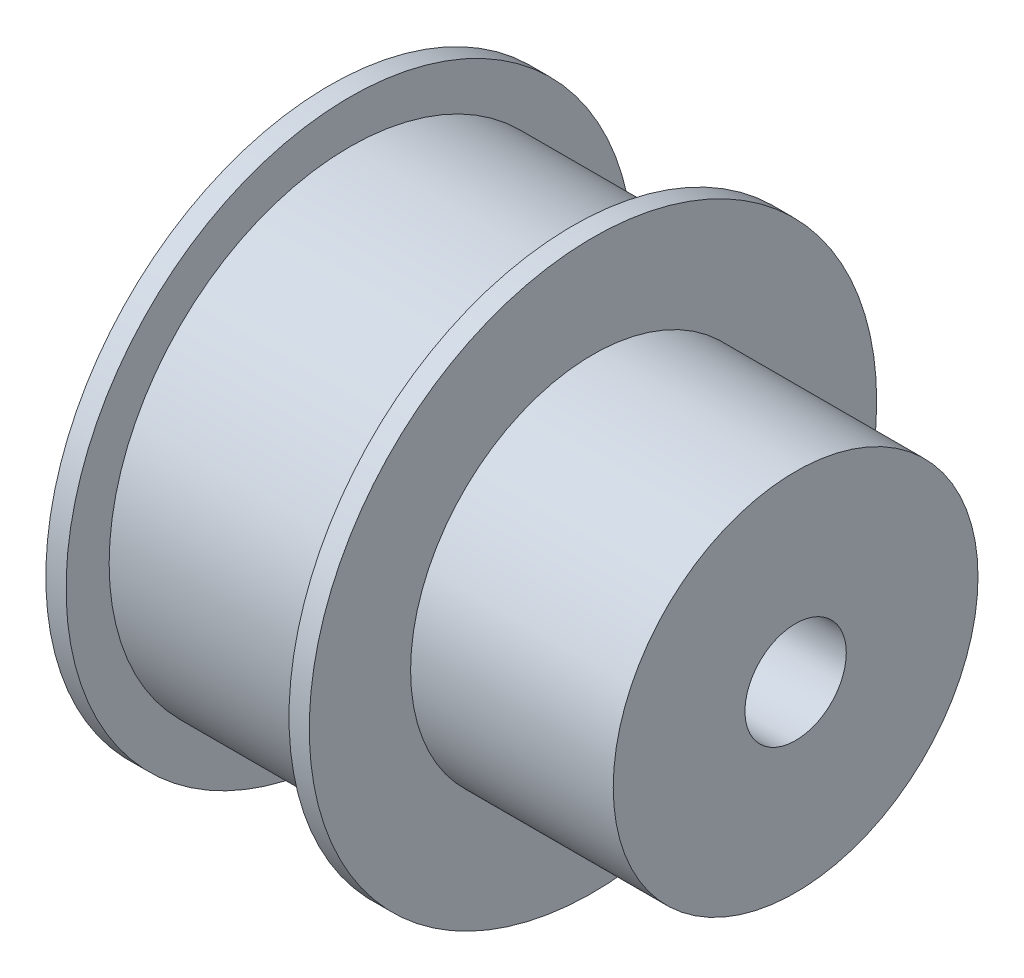
ISO-10303-21;
HEADER;
FILE_DESCRIPTION(('STEP AP214'),'2;1');
FILE_NAME('part.step','',(''),(''),'','','');
FILE_SCHEMA(('AUTOMOTIVE_DESIGN { 1 0 10303 214 1 1 1 1 }'));
ENDSEC;
DATA;
#1=APPLICATION_CONTEXT('core data for automotive mechanical design processes');
#2=APPLICATION_PROTOCOL_DEFINITION('international standard','automotive_design',2000,#1);
#3=PRODUCT_CONTEXT('',#1,'mechanical');
#4=PRODUCT('Part','Part','',(#3));
#5=PRODUCT_RELATED_PRODUCT_CATEGORY('part','',(#4));
#6=PRODUCT_DEFINITION_FORMATION('','',#4);
#7=PRODUCT_DEFINITION_CONTEXT('part definition',#1,'design');
#8=PRODUCT_DEFINITION('design','',#6,#7);
#9=PRODUCT_DEFINITION_SHAPE('','',#8);
#10=(LENGTH_UNIT() NAMED_UNIT(*) SI_UNIT(.MILLI.,.METRE.));
#11=(NAMED_UNIT(*) PLANE_ANGLE_UNIT() SI_UNIT($,.RADIAN.));
#12=(NAMED_UNIT(*) SI_UNIT($,.STERADIAN.) SOLID_ANGLE_UNIT());
#13=UNCERTAINTY_MEASURE_WITH_UNIT(LENGTH_MEASURE(1.E-05),#10,'distance_accuracy_value','');
#14=(GEOMETRIC_REPRESENTATION_CONTEXT(3) GLOBAL_UNCERTAINTY_ASSIGNED_CONTEXT((#13)) GLOBAL_UNIT_ASSIGNED_CONTEXT((#10,
#11,#12)) REPRESENTATION_CONTEXT('',''));
#15=CARTESIAN_POINT('',(0.,0.,0.));
#16=DIRECTION('',(0.,0.,1.));
#17=DIRECTION('',(1.,0.,0.));
#18=AXIS2_PLACEMENT_3D('',#15,#16,#17);
#19=CARTESIAN_POINT('',(1.,0.,0.));
#20=DIRECTION('',(-1.,0.,0.));
#21=DIRECTION('',(0.,0.,1.));
#22=AXIS2_PLACEMENT_3D('',#19,#20,#21);
#23=CYLINDRICAL_SURFACE('',#22,14.);
#24=CARTESIAN_POINT('',(1.,0.,0.));
#25=DIRECTION('',(1.,0.,0.));
#26=DIRECTION('',(0.,0.,-1.));
#27=AXIS2_PLACEMENT_3D('',#24,#25,#26);
#28=CIRCLE('',#27,14.);
#29=CARTESIAN_POINT('',(1.,0.,-14.));
#30=VERTEX_POINT('',#29);
#31=EDGE_CURVE('E10',#30,#30,#28,.T.);
#32=ORIENTED_EDGE('',*,*,#31,.F.);
#33=EDGE_LOOP('',(#32));
#34=FACE_BOUND('',#33,.T.);
#35=CARTESIAN_POINT('',(0.,0.,0.));
#36=DIRECTION('',(1.,0.,0.));
#37=DIRECTION('',(0.,0.,-1.));
#38=AXIS2_PLACEMENT_3D('',#35,#36,#37);
#39=CIRCLE('',#38,14.);
#40=CARTESIAN_POINT('',(0.,0.,-14.));
#41=VERTEX_POINT('',#40);
#42=EDGE_CURVE('E33',#41,#41,#39,.T.);
#43=ORIENTED_EDGE('',*,*,#42,.T.);
#44=EDGE_LOOP('',(#43));
#45=FACE_BOUND('',#44,.T.);
#46=ADVANCED_FACE('F30',(#34,#45),#23,.T.);
#47=CARTESIAN_POINT('',(1.,0.,0.));
#48=DIRECTION('',(1.,0.,0.));
#49=DIRECTION('',(0.,0.,-1.));
#50=AXIS2_PLACEMENT_3D('',#47,#48,#49);
#51=PLANE('',#50);
#52=CARTESIAN_POINT('',(1.,0.,0.));
#53=DIRECTION('',(1.,0.,0.));
#54=DIRECTION('',(0.,0.,-1.));
#55=AXIS2_PLACEMENT_3D('',#52,#53,#54);
#56=CIRCLE('',#55,11.875);
#57=CARTESIAN_POINT('',(1.,0.,-11.875));
#58=VERTEX_POINT('',#57);
#59=EDGE_CURVE('E42',#58,#58,#56,.T.);
#60=ORIENTED_EDGE('',*,*,#59,.F.);
#61=EDGE_LOOP('',(#60));
#62=FACE_BOUND('',#61,.T.);
#63=ORIENTED_EDGE('',*,*,#31,.T.);
#64=EDGE_LOOP('',(#63));
#65=FACE_BOUND('',#64,.T.);
#66=ADVANCED_FACE('F107',(#62,#65),#51,.T.);
#67=CARTESIAN_POINT('',(0.,0.,0.));
#68=DIRECTION('',(1.,0.,0.));
#69=DIRECTION('',(0.,0.,-1.));
#70=AXIS2_PLACEMENT_3D('',#67,#68,#69);
#71=PLANE('',#70);
#72=CARTESIAN_POINT('',(0.,0.,0.));
#73=DIRECTION('',(1.,0.,0.));
#74=DIRECTION('',(0.,0.,-1.));
#75=AXIS2_PLACEMENT_3D('',#72,#73,#74);
#76=CIRCLE('',#75,2.5);
#77=CARTESIAN_POINT('',(0.,0.,-2.5));
#78=VERTEX_POINT('',#77);
#79=EDGE_CURVE('E57',#78,#78,#76,.T.);
#80=ORIENTED_EDGE('',*,*,#79,.T.);
#81=EDGE_LOOP('',(#80));
#82=FACE_BOUND('',#81,.T.);
#83=ORIENTED_EDGE('',*,*,#42,.F.);
#84=EDGE_LOOP('',(#83));
#85=FACE_BOUND('',#84,.T.);
#86=ADVANCED_FACE('F66',(#82,#85),#71,.F.);
#87=CARTESIAN_POINT('',(12.,0.,0.));
#88=DIRECTION('',(-1.,0.,0.));
#89=DIRECTION('',(0.,0.,1.));
#90=AXIS2_PLACEMENT_3D('',#87,#88,#89);
#91=CYLINDRICAL_SURFACE('',#90,11.875);
#92=CARTESIAN_POINT('',(12.,0.,0.));
#93=DIRECTION('',(1.,0.,0.));
#94=DIRECTION('',(0.,0.,-1.));
#95=AXIS2_PLACEMENT_3D('',#92,#93,#94);
#96=CIRCLE('',#95,11.875);
#97=CARTESIAN_POINT('',(12.,0.,-11.875));
#98=VERTEX_POINT('',#97);
#99=EDGE_CURVE('E40',#98,#98,#96,.T.);
#100=ORIENTED_EDGE('',*,*,#99,.F.);
#101=EDGE_LOOP('',(#100));
#102=FACE_BOUND('',#101,.T.);
#103=ORIENTED_EDGE('',*,*,#59,.T.);
#104=EDGE_LOOP('',(#103));
#105=FACE_BOUND('',#104,.T.);
#106=ADVANCED_FACE('F97',(#102,#105),#91,.T.);
#107=CARTESIAN_POINT('',(13.,0.,0.));
#108=DIRECTION('',(-1.,0.,0.));
#109=DIRECTION('',(0.,0.,1.));
#110=AXIS2_PLACEMENT_3D('',#107,#108,#109);
#111=CYLINDRICAL_SURFACE('',#110,14.);
#112=CARTESIAN_POINT('',(13.,0.,0.));
#113=DIRECTION('',(1.,0.,0.));
#114=DIRECTION('',(0.,0.,-1.));
#115=AXIS2_PLACEMENT_3D('',#112,#113,#114);
#116=CIRCLE('',#115,14.);
#117=CARTESIAN_POINT('',(13.,0.,-14.));
#118=VERTEX_POINT('',#117);
#119=EDGE_CURVE('E45',#118,#118,#116,.T.);
#120=ORIENTED_EDGE('',*,*,#119,.F.);
#121=EDGE_LOOP('',(#120));
#122=FACE_BOUND('',#121,.T.);
#123=CARTESIAN_POINT('',(12.,0.,0.));
#124=DIRECTION('',(1.,0.,0.));
#125=DIRECTION('',(0.,0.,-1.));
#126=AXIS2_PLACEMENT_3D('',#123,#124,#125);
#127=CIRCLE('',#126,14.);
#128=CARTESIAN_POINT('',(12.,0.,-14.));
#129=VERTEX_POINT('',#128);
#130=EDGE_CURVE('E48',#129,#129,#127,.T.);
#131=ORIENTED_EDGE('',*,*,#130,.T.);
#132=EDGE_LOOP('',(#131));
#133=FACE_BOUND('',#132,.T.);
#134=ADVANCED_FACE('F91',(#122,#133),#111,.T.);
#135=CARTESIAN_POINT('',(13.,0.,0.));
#136=DIRECTION('',(1.,0.,0.));
#137=DIRECTION('',(0.,0.,-1.));
#138=AXIS2_PLACEMENT_3D('',#135,#136,#137);
#139=PLANE('',#138);
#140=CARTESIAN_POINT('',(13.,0.,0.));
#141=DIRECTION('',(1.,0.,0.));
#142=DIRECTION('',(0.,0.,-1.));
#143=AXIS2_PLACEMENT_3D('',#140,#141,#142);
#144=CIRCLE('',#143,9.);
#145=CARTESIAN_POINT('',(13.,0.,-9.));
#146=VERTEX_POINT('',#145);
#147=EDGE_CURVE('E54',#146,#146,#144,.T.);
#148=ORIENTED_EDGE('',*,*,#147,.F.);
#149=EDGE_LOOP('',(#148));
#150=FACE_BOUND('',#149,.T.);
#151=ORIENTED_EDGE('',*,*,#119,.T.);
#152=EDGE_LOOP('',(#151));
#153=FACE_BOUND('',#152,.T.);
#154=ADVANCED_FACE('F88',(#150,#153),#139,.T.);
#155=CARTESIAN_POINT('',(12.,0.,0.));
#156=DIRECTION('',(1.,0.,0.));
#157=DIRECTION('',(0.,0.,-1.));
#158=AXIS2_PLACEMENT_3D('',#155,#156,#157);
#159=PLANE('',#158);
#160=ORIENTED_EDGE('',*,*,#99,.T.);
#161=EDGE_LOOP('',(#160));
#162=FACE_BOUND('',#161,.T.);
#163=ORIENTED_EDGE('',*,*,#130,.F.);
#164=EDGE_LOOP('',(#163));
#165=FACE_BOUND('',#164,.T.);
#166=ADVANCED_FACE('F84',(#162,#165),#159,.F.);
#167=CARTESIAN_POINT('',(23.,0.,0.));
#168=DIRECTION('',(-1.,0.,0.));
#169=DIRECTION('',(0.,0.,1.));
#170=AXIS2_PLACEMENT_3D('',#167,#168,#169);
#171=CYLINDRICAL_SURFACE('',#170,9.);
#172=CARTESIAN_POINT('',(23.,0.,0.));
#173=DIRECTION('',(1.,0.,0.));
#174=DIRECTION('',(0.,0.,-1.));
#175=AXIS2_PLACEMENT_3D('',#172,#173,#174);
#176=CIRCLE('',#175,9.);
#177=CARTESIAN_POINT('',(23.,0.,-9.));
#178=VERTEX_POINT('',#177);
#179=EDGE_CURVE('E51',#178,#178,#176,.T.);
#180=ORIENTED_EDGE('',*,*,#179,.F.);
#181=EDGE_LOOP('',(#180));
#182=FACE_BOUND('',#181,.T.);
#183=ORIENTED_EDGE('',*,*,#147,.T.);
#184=EDGE_LOOP('',(#183));
#185=FACE_BOUND('',#184,.T.);
#186=ADVANCED_FACE('F78',(#182,#185),#171,.T.);
#187=CARTESIAN_POINT('',(23.,0.,0.));
#188=DIRECTION('',(1.,0.,0.));
#189=DIRECTION('',(0.,0.,-1.));
#190=AXIS2_PLACEMENT_3D('',#187,#188,#189);
#191=PLANE('',#190);
#192=CARTESIAN_POINT('',(23.,0.,0.));
#193=DIRECTION('',(1.,0.,0.));
#194=DIRECTION('',(0.,0.,-1.));
#195=AXIS2_PLACEMENT_3D('',#192,#193,#194);
#196=CIRCLE('',#195,2.5);
#197=CARTESIAN_POINT('',(23.,0.,-2.5));
#198=VERTEX_POINT('',#197);
#199=EDGE_CURVE('E60',#198,#198,#196,.T.);
#200=ORIENTED_EDGE('',*,*,#199,.F.);
#201=EDGE_LOOP('',(#200));
#202=FACE_BOUND('',#201,.T.);
#203=ORIENTED_EDGE('',*,*,#179,.T.);
#204=EDGE_LOOP('',(#203));
#205=FACE_BOUND('',#204,.T.);
#206=ADVANCED_FACE('F72',(#202,#205),#191,.T.);
#207=CARTESIAN_POINT('',(0.,0.,0.));
#208=DIRECTION('',(1.,0.,0.));
#209=DIRECTION('',(0.,0.,-1.));
#210=AXIS2_PLACEMENT_3D('',#207,#208,#209);
#211=CYLINDRICAL_SURFACE('',#210,2.5);
#212=ORIENTED_EDGE('',*,*,#79,.F.);
#213=EDGE_LOOP('',(#212));
#214=FACE_BOUND('',#213,.T.);
#215=ORIENTED_EDGE('',*,*,#199,.T.);
#216=EDGE_LOOP('',(#215));
#217=FACE_BOUND('',#216,.T.);
#218=ADVANCED_FACE('F69',(#214,#217),#211,.F.);
#219=CLOSED_SHELL('',(#46,#66,#86,#106,#134,#154,#166,#186,#206,#218));
#220=MANIFOLD_SOLID_BREP('B2',#219);
#221=ADVANCED_BREP_SHAPE_REPRESENTATION('',(#18,#220),#14);
#222=SHAPE_DEFINITION_REPRESENTATION(#9,#221);
ENDSEC;
END-ISO-10303-21;
